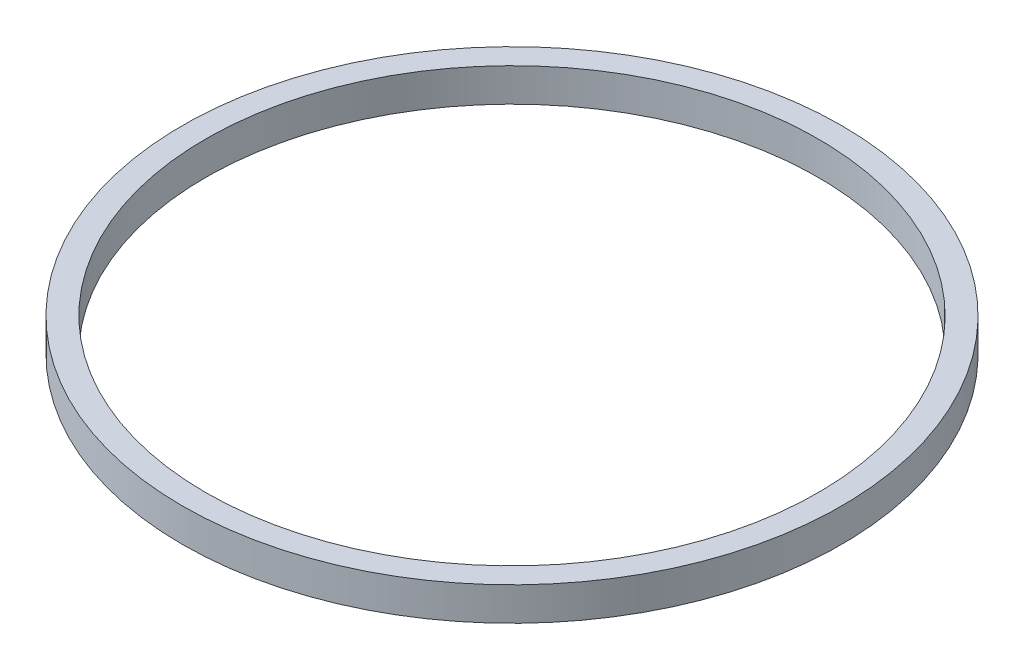
ISO-10303-21;
HEADER;
FILE_DESCRIPTION(('STEP AP214'),'2;1');
FILE_NAME('part.step','',(''),(''),'','','');
FILE_SCHEMA(('AUTOMOTIVE_DESIGN { 1 0 10303 214 1 1 1 1 }'));
ENDSEC;
DATA;
#1=APPLICATION_CONTEXT('core data for automotive mechanical design processes');
#2=APPLICATION_PROTOCOL_DEFINITION('international standard','automotive_design',2000,#1);
#3=PRODUCT_CONTEXT('',#1,'mechanical');
#4=PRODUCT('Part','Part','',(#3));
#5=PRODUCT_RELATED_PRODUCT_CATEGORY('part','',(#4));
#6=PRODUCT_DEFINITION_FORMATION('','',#4);
#7=PRODUCT_DEFINITION_CONTEXT('part definition',#1,'design');
#8=PRODUCT_DEFINITION('design','',#6,#7);
#9=PRODUCT_DEFINITION_SHAPE('','',#8);
#10=(LENGTH_UNIT() NAMED_UNIT(*) SI_UNIT(.MILLI.,.METRE.));
#11=(NAMED_UNIT(*) PLANE_ANGLE_UNIT() SI_UNIT($,.RADIAN.));
#12=(NAMED_UNIT(*) SI_UNIT($,.STERADIAN.) SOLID_ANGLE_UNIT());
#13=UNCERTAINTY_MEASURE_WITH_UNIT(LENGTH_MEASURE(1.E-05),#10,'distance_accuracy_value','');
#14=(GEOMETRIC_REPRESENTATION_CONTEXT(3) GLOBAL_UNCERTAINTY_ASSIGNED_CONTEXT((#13)) GLOBAL_UNIT_ASSIGNED_CONTEXT((#10,
#11,#12)) REPRESENTATION_CONTEXT('',''));
#15=CARTESIAN_POINT('',(0.,0.,0.));
#16=DIRECTION('',(0.,0.,1.));
#17=DIRECTION('',(1.,0.,0.));
#18=AXIS2_PLACEMENT_3D('',#15,#16,#17);
#19=CARTESIAN_POINT('',(0.,109.22,0.));
#20=DIRECTION('',(0.,1.,0.));
#21=DIRECTION('',(0.,0.,1.));
#22=AXIS2_PLACEMENT_3D('',#19,#20,#21);
#23=PLANE('',#22);
#24=CARTESIAN_POINT('',(0.,109.22,0.));
#25=DIRECTION('',(0.,1.,0.));
#26=DIRECTION('',(0.,0.,1.));
#27=AXIS2_PLACEMENT_3D('',#24,#25,#26);
#28=CIRCLE('',#27,1079.5);
#29=CARTESIAN_POINT('',(0.,109.22,1079.5));
#30=VERTEX_POINT('',#29);
#31=EDGE_CURVE('E10',#30,#30,#28,.T.);
#32=ORIENTED_EDGE('',*,*,#31,.T.);
#33=EDGE_LOOP('',(#32));
#34=FACE_BOUND('',#33,.T.);
#35=CARTESIAN_POINT('',(0.,109.22,0.));
#36=DIRECTION('',(0.,1.,0.));
#37=DIRECTION('',(0.,0.,1.));
#38=AXIS2_PLACEMENT_3D('',#35,#36,#37);
#39=CIRCLE('',#38,1003.3);
#40=CARTESIAN_POINT('',(0.,109.22,1003.3));
#41=VERTEX_POINT('',#40);
#42=EDGE_CURVE('E55',#41,#41,#39,.T.);
#43=ORIENTED_EDGE('',*,*,#42,.F.);
#44=EDGE_LOOP('',(#43));
#45=FACE_BOUND('',#44,.T.);
#46=ADVANCED_FACE('F41',(#34,#45),#23,.T.);
#47=CARTESIAN_POINT('',(0.,0.,0.));
#48=DIRECTION('',(0.,1.,0.));
#49=DIRECTION('',(0.,0.,1.));
#50=AXIS2_PLACEMENT_3D('',#47,#48,#49);
#51=PLANE('',#50);
#52=CARTESIAN_POINT('',(0.,0.,0.));
#53=DIRECTION('',(0.,1.,0.));
#54=DIRECTION('',(0.,0.,1.));
#55=AXIS2_PLACEMENT_3D('',#52,#53,#54);
#56=CIRCLE('',#55,1079.5);
#57=CARTESIAN_POINT('',(0.,0.,1079.5));
#58=VERTEX_POINT('',#57);
#59=EDGE_CURVE('E44',#58,#58,#56,.T.);
#60=ORIENTED_EDGE('',*,*,#59,.F.);
#61=EDGE_LOOP('',(#60));
#62=FACE_BOUND('',#61,.T.);
#63=CARTESIAN_POINT('',(0.,0.,0.));
#64=DIRECTION('',(0.,1.,0.));
#65=DIRECTION('',(0.,0.,1.));
#66=AXIS2_PLACEMENT_3D('',#63,#64,#65);
#67=CIRCLE('',#66,1003.3);
#68=CARTESIAN_POINT('',(0.,0.,1003.3));
#69=VERTEX_POINT('',#68);
#70=EDGE_CURVE('E53',#69,#69,#67,.T.);
#71=ORIENTED_EDGE('',*,*,#70,.T.);
#72=EDGE_LOOP('',(#71));
#73=FACE_BOUND('',#72,.T.);
#74=ADVANCED_FACE('F63',(#62,#73),#51,.F.);
#75=CARTESIAN_POINT('',(0.,109.22,0.));
#76=DIRECTION('',(0.,-1.,0.));
#77=DIRECTION('',(0.,0.,-1.));
#78=AXIS2_PLACEMENT_3D('',#75,#76,#77);
#79=CYLINDRICAL_SURFACE('',#78,1079.5);
#80=ORIENTED_EDGE('',*,*,#31,.F.);
#81=EDGE_LOOP('',(#80));
#82=FACE_BOUND('',#81,.T.);
#83=ORIENTED_EDGE('',*,*,#59,.T.);
#84=EDGE_LOOP('',(#83));
#85=FACE_BOUND('',#84,.T.);
#86=ADVANCED_FACE('F43',(#82,#85),#79,.T.);
#87=CARTESIAN_POINT('',(0.,109.22,0.));
#88=DIRECTION('',(0.,-1.,0.));
#89=DIRECTION('',(0.,0.,-1.));
#90=AXIS2_PLACEMENT_3D('',#87,#88,#89);
#91=CYLINDRICAL_SURFACE('',#90,1003.3);
#92=ORIENTED_EDGE('',*,*,#42,.T.);
#93=EDGE_LOOP('',(#92));
#94=FACE_BOUND('',#93,.T.);
#95=ORIENTED_EDGE('',*,*,#70,.F.);
#96=EDGE_LOOP('',(#95));
#97=FACE_BOUND('',#96,.T.);
#98=ADVANCED_FACE('F58',(#94,#97),#91,.F.);
#99=CLOSED_SHELL('',(#46,#74,#86,#98));
#100=MANIFOLD_SOLID_BREP('B2',#99);
#101=ADVANCED_BREP_SHAPE_REPRESENTATION('',(#18,#100),#14);
#102=SHAPE_DEFINITION_REPRESENTATION(#9,#101);
ENDSEC;
END-ISO-10303-21;
